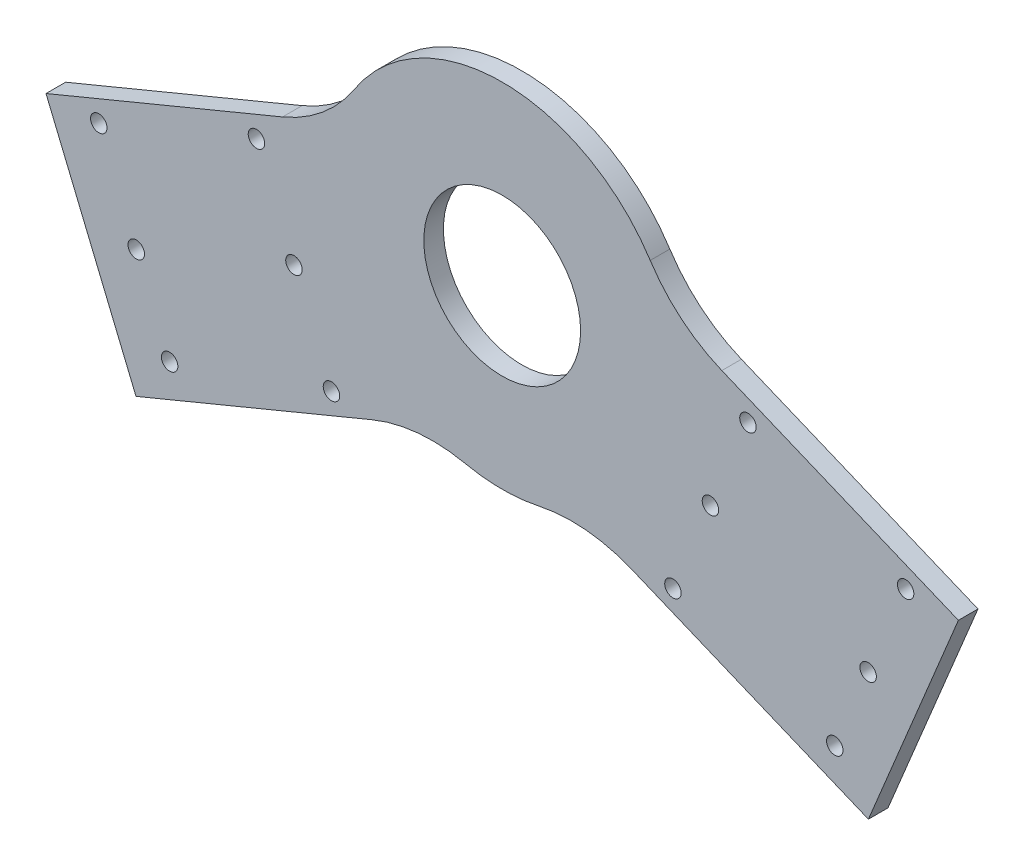
ISO-10303-21;
HEADER;
FILE_DESCRIPTION(('STEP AP214'),'2;1');
FILE_NAME('part.step','',(''),(''),'','','');
FILE_SCHEMA(('AUTOMOTIVE_DESIGN { 1 0 10303 214 1 1 1 1 }'));
ENDSEC;
DATA;
#1=APPLICATION_CONTEXT('core data for automotive mechanical design processes');
#2=APPLICATION_PROTOCOL_DEFINITION('international standard','automotive_design',2000,#1);
#3=PRODUCT_CONTEXT('',#1,'mechanical');
#4=PRODUCT('Part','Part','',(#3));
#5=PRODUCT_RELATED_PRODUCT_CATEGORY('part','',(#4));
#6=PRODUCT_DEFINITION_FORMATION('','',#4);
#7=PRODUCT_DEFINITION_CONTEXT('part definition',#1,'design');
#8=PRODUCT_DEFINITION('design','',#6,#7);
#9=PRODUCT_DEFINITION_SHAPE('','',#8);
#10=(LENGTH_UNIT() NAMED_UNIT(*) SI_UNIT(.MILLI.,.METRE.));
#11=(NAMED_UNIT(*) PLANE_ANGLE_UNIT() SI_UNIT($,.RADIAN.));
#12=(NAMED_UNIT(*) SI_UNIT($,.STERADIAN.) SOLID_ANGLE_UNIT());
#13=UNCERTAINTY_MEASURE_WITH_UNIT(LENGTH_MEASURE(1.E-05),#10,'distance_accuracy_value','');
#14=(GEOMETRIC_REPRESENTATION_CONTEXT(3) GLOBAL_UNCERTAINTY_ASSIGNED_CONTEXT((#13)) GLOBAL_UNIT_ASSIGNED_CONTEXT((#10,
#11,#12)) REPRESENTATION_CONTEXT('',''));
#15=CARTESIAN_POINT('',(0.,0.,0.));
#16=DIRECTION('',(0.,0.,1.));
#17=DIRECTION('',(1.,0.,0.));
#18=AXIS2_PLACEMENT_3D('',#15,#16,#17);
#19=CARTESIAN_POINT('',(0.,0.,5.));
#20=DIRECTION('',(0.,0.,-1.));
#21=DIRECTION('',(-1.,0.,0.));
#22=AXIS2_PLACEMENT_3D('',#19,#20,#21);
#23=CYLINDRICAL_SURFACE('',#22,45.);
#24=CARTESIAN_POINT('',(0.,0.,0.));
#25=DIRECTION('',(0.,0.,1.));
#26=DIRECTION('',(1.,0.,0.));
#27=AXIS2_PLACEMENT_3D('',#24,#25,#26);
#28=CIRCLE('',#27,45.);
#29=CARTESIAN_POINT('',(9.40236221556252,-44.006767488278,0.));
#30=VERTEX_POINT('',#29);
#31=CARTESIAN_POINT('',(-9.40236221556252,-44.006767488278,0.));
#32=VERTEX_POINT('',#31);
#33=EDGE_CURVE('E244',#30,#32,#28,.F.);
#34=ORIENTED_EDGE('',*,*,#33,.F.);
#35=DIRECTION('',(0.,0.,-1.));
#36=VECTOR('',#35,1.);
#37=CARTESIAN_POINT('',(9.40236221556252,-44.006767488278,5.));
#38=LINE('',#37,#36);
#39=CARTESIAN_POINT('',(9.40236221556252,-44.006767488278,5.));
#40=VERTEX_POINT('',#39);
#41=EDGE_CURVE('E315',#30,#40,#38,.F.);
#42=ORIENTED_EDGE('',*,*,#41,.T.);
#43=CARTESIAN_POINT('',(0.,0.,5.));
#44=DIRECTION('',(0.,0.,1.));
#45=DIRECTION('',(1.,0.,0.));
#46=AXIS2_PLACEMENT_3D('',#43,#44,#45);
#47=CIRCLE('',#46,45.);
#48=CARTESIAN_POINT('',(-9.40236221556252,-44.006767488278,5.));
#49=VERTEX_POINT('',#48);
#50=EDGE_CURVE('E167',#40,#49,#47,.F.);
#51=ORIENTED_EDGE('',*,*,#50,.T.);
#52=DIRECTION('',(0.,0.,-1.));
#53=VECTOR('',#52,1.);
#54=CARTESIAN_POINT('',(-9.40236221556252,-44.006767488278,5.));
#55=LINE('',#54,#53);
#56=EDGE_CURVE('E311',#49,#32,#55,.T.);
#57=ORIENTED_EDGE('',*,*,#56,.T.);
#58=EDGE_LOOP('',(#34,#42,#51,#57));
#59=FACE_BOUND('',#58,.T.);
#60=ADVANCED_FACE('F46',(#59),#23,.T.);
#61=CARTESIAN_POINT('',(-11.4805029709528,-27.7163859753385,5.));
#62=DIRECTION('',(-0.382683432365094,-0.923879532511285,0.));
#63=DIRECTION('',(0.923879532511285,-0.382683432365094,0.));
#64=AXIS2_PLACEMENT_3D('',#61,#62,#63);
#65=PLANE('',#64);
#66=DIRECTION('',(-0.923879532511285,0.382683432365094,0.));
#67=VECTOR('',#66,1.);
#68=CARTESIAN_POINT('',(-11.4805029709528,-27.7163859753385,5.));
#69=LINE('',#68,#67);
#70=CARTESIAN_POINT('',(93.4177211956894,-71.1666530940154,5.));
#71=VERTEX_POINT('',#70);
#72=CARTESIAN_POINT('',(33.0673548128885,-46.1687128440737,5.));
#73=VERTEX_POINT('',#72);
#74=EDGE_CURVE('E141',#71,#73,#69,.T.);
#75=ORIENTED_EDGE('',*,*,#74,.T.);
#76=DIRECTION('',(0.,0.,1.));
#77=VECTOR('',#76,1.);
#78=CARTESIAN_POINT('',(33.0673548128885,-46.1687128440737,0.));
#79=LINE('',#78,#77);
#80=CARTESIAN_POINT('',(33.0673548128885,-46.1687128440737,0.));
#81=VERTEX_POINT('',#80);
#82=EDGE_CURVE('E149',#73,#81,#79,.F.);
#83=ORIENTED_EDGE('',*,*,#82,.T.);
#84=DIRECTION('',(-0.923879532511285,0.382683432365094,0.));
#85=VECTOR('',#84,1.);
#86=CARTESIAN_POINT('',(-11.4805029709528,-27.7163859753385,0.));
#87=LINE('',#86,#85);
#88=CARTESIAN_POINT('',(93.4177211956894,-71.1666530940154,0.));
#89=VERTEX_POINT('',#88);
#90=EDGE_CURVE('E144',#89,#81,#87,.T.);
#91=ORIENTED_EDGE('',*,*,#90,.F.);
#92=DIRECTION('',(0.,0.,-1.));
#93=VECTOR('',#92,1.);
#94=CARTESIAN_POINT('',(93.4177211956894,-71.1666530940154,5.));
#95=LINE('',#94,#93);
#96=EDGE_CURVE('E136',#71,#89,#95,.T.);
#97=ORIENTED_EDGE('',*,*,#96,.F.);
#98=EDGE_LOOP('',(#75,#83,#91,#97));
#99=FACE_BOUND('',#98,.T.);
#100=ADVANCED_FACE('F138',(#99),#65,.T.);
#101=CARTESIAN_POINT('',(104.898224166642,-43.4502671186769,5.));
#102=DIRECTION('',(-0.923879532511285,0.382683432365094,0.));
#103=DIRECTION('',(-0.382683432365094,-0.923879532511285,0.));
#104=AXIS2_PLACEMENT_3D('',#101,#102,#103);
#105=PLANE('',#104);
#106=DIRECTION('',(0.382683432365094,0.923879532511285,0.));
#107=VECTOR('',#106,1.);
#108=CARTESIAN_POINT('',(104.898224166642,-43.4502671186769,0.));
#109=LINE('',#108,#107);
#110=CARTESIAN_POINT('',(116.378727137595,-15.7338811433383,0.));
#111=VERTEX_POINT('',#110);
#112=EDGE_CURVE('E250',#89,#111,#109,.T.);
#113=ORIENTED_EDGE('',*,*,#112,.T.);
#114=DIRECTION('',(0.,0.,-1.));
#115=VECTOR('',#114,1.);
#116=CARTESIAN_POINT('',(116.378727137595,-15.7338811433383,5.));
#117=LINE('',#116,#115);
#118=CARTESIAN_POINT('',(116.378727137595,-15.7338811433383,5.));
#119=VERTEX_POINT('',#118);
#120=EDGE_CURVE('E150',#119,#111,#117,.T.);
#121=ORIENTED_EDGE('',*,*,#120,.F.);
#122=DIRECTION('',(0.382683432365094,0.923879532511285,0.));
#123=VECTOR('',#122,1.);
#124=CARTESIAN_POINT('',(104.898224166642,-43.4502671186769,5.));
#125=LINE('',#124,#123);
#126=EDGE_CURVE('E154',#71,#119,#125,.T.);
#127=ORIENTED_EDGE('',*,*,#126,.F.);
#128=ORIENTED_EDGE('',*,*,#96,.T.);
#129=EDGE_LOOP('',(#113,#121,#127,#128));
#130=FACE_BOUND('',#129,.T.);
#131=ADVANCED_FACE('F155',(#130),#105,.F.);
#132=CARTESIAN_POINT('',(11.4805029709528,27.7163859753386,5.));
#133=DIRECTION('',(-0.382683432365094,-0.923879532511285,0.));
#134=DIRECTION('',(0.923879532511285,-0.382683432365094,0.));
#135=AXIS2_PLACEMENT_3D('',#132,#133,#134);
#136=PLANE('',#135);
#137=DIRECTION('',(-0.923879532511285,0.382683432365094,0.));
#138=VECTOR('',#137,1.);
#139=CARTESIAN_POINT('',(11.4805029709528,27.7163859753386,0.));
#140=LINE('',#139,#138);
#141=CARTESIAN_POINT('',(56.0283607547941,9.26405910660341,0.));
#142=VERTEX_POINT('',#141);
#143=EDGE_CURVE('E253',#111,#142,#140,.T.);
#144=ORIENTED_EDGE('',*,*,#143,.T.);
#145=DIRECTION('',(0.,0.,1.));
#146=VECTOR('',#145,1.);
#147=CARTESIAN_POINT('',(56.0283607547941,9.26405910660341,5.));
#148=LINE('',#147,#146);
#149=CARTESIAN_POINT('',(56.0283607547941,9.26405910660341,5.));
#150=VERTEX_POINT('',#149);
#151=EDGE_CURVE('E328',#142,#150,#148,.T.);
#152=ORIENTED_EDGE('',*,*,#151,.T.);
#153=DIRECTION('',(-0.923879532511285,0.382683432365094,0.));
#154=VECTOR('',#153,1.);
#155=CARTESIAN_POINT('',(11.4805029709528,27.7163859753386,5.));
#156=LINE('',#155,#154);
#157=EDGE_CURVE('E159',#119,#150,#156,.T.);
#158=ORIENTED_EDGE('',*,*,#157,.F.);
#159=ORIENTED_EDGE('',*,*,#120,.T.);
#160=EDGE_LOOP('',(#144,#152,#158,#159));
#161=FACE_BOUND('',#160,.T.);
#162=ADVANCED_FACE('F507',(#161),#136,.F.);
#163=CARTESIAN_POINT('',(0.,0.,5.));
#164=DIRECTION('',(0.,0.,-1.));
#165=DIRECTION('',(-1.,0.,0.));
#166=AXIS2_PLACEMENT_3D('',#163,#164,#165);
#167=CYLINDRICAL_SURFACE('',#166,45.);
#168=CARTESIAN_POINT('',(0.,0.,5.));
#169=DIRECTION('',(0.,0.,1.));
#170=DIRECTION('',(1.,0.,0.));
#171=AXIS2_PLACEMENT_3D('',#168,#169,#170);
#172=CIRCLE('',#171,45.);
#173=CARTESIAN_POINT('',(37.7659577908577,24.4690096272643,5.));
#174=VERTEX_POINT('',#173);
#175=CARTESIAN_POINT('',(-37.7659577908577,24.4690096272643,5.));
#176=VERTEX_POINT('',#175);
#177=EDGE_CURVE('E177',#174,#176,#172,.T.);
#178=ORIENTED_EDGE('',*,*,#177,.F.);
#179=DIRECTION('',(0.,0.,-1.));
#180=VECTOR('',#179,1.);
#181=CARTESIAN_POINT('',(37.7659577908577,24.4690096272643,5.));
#182=LINE('',#181,#180);
#183=CARTESIAN_POINT('',(37.7659577908577,24.4690096272643,0.));
#184=VERTEX_POINT('',#183);
#185=EDGE_CURVE('E324',#174,#184,#182,.T.);
#186=ORIENTED_EDGE('',*,*,#185,.T.);
#187=CARTESIAN_POINT('',(0.,0.,0.));
#188=DIRECTION('',(0.,0.,1.));
#189=DIRECTION('',(1.,0.,0.));
#190=AXIS2_PLACEMENT_3D('',#187,#188,#189);
#191=CIRCLE('',#190,45.);
#192=CARTESIAN_POINT('',(-37.7659577908577,24.4690096272643,0.));
#193=VERTEX_POINT('',#192);
#194=EDGE_CURVE('E257',#184,#193,#191,.T.);
#195=ORIENTED_EDGE('',*,*,#194,.T.);
#196=DIRECTION('',(0.,0.,-1.));
#197=VECTOR('',#196,1.);
#198=CARTESIAN_POINT('',(-37.7659577908577,24.4690096272643,5.));
#199=LINE('',#198,#197);
#200=EDGE_CURVE('E321',#193,#176,#199,.F.);
#201=ORIENTED_EDGE('',*,*,#200,.T.);
#202=EDGE_LOOP('',(#178,#186,#195,#201));
#203=FACE_BOUND('',#202,.T.);
#204=ADVANCED_FACE('F358',(#203),#167,.T.);
#205=CARTESIAN_POINT('',(-11.4805029709528,27.7163859753386,5.));
#206=DIRECTION('',(-0.382683432365094,0.923879532511285,0.));
#207=DIRECTION('',(-0.923879532511285,-0.382683432365094,0.));
#208=AXIS2_PLACEMENT_3D('',#205,#206,#207);
#209=PLANE('',#208);
#210=DIRECTION('',(0.923879532511285,0.382683432365094,0.));
#211=VECTOR('',#210,1.);
#212=CARTESIAN_POINT('',(-11.4805029709528,27.7163859753386,5.));
#213=LINE('',#212,#211);
#214=CARTESIAN_POINT('',(-116.378727137595,-15.7338811433383,5.));
#215=VERTEX_POINT('',#214);
#216=CARTESIAN_POINT('',(-56.0283607547941,9.26405910660341,5.));
#217=VERTEX_POINT('',#216);
#218=EDGE_CURVE('E180',#215,#217,#213,.T.);
#219=ORIENTED_EDGE('',*,*,#218,.T.);
#220=DIRECTION('',(0.,0.,-1.));
#221=VECTOR('',#220,1.);
#222=CARTESIAN_POINT('',(-56.0283607547941,9.26405910660341,5.));
#223=LINE('',#222,#221);
#224=CARTESIAN_POINT('',(-56.0283607547941,9.26405910660341,0.));
#225=VERTEX_POINT('',#224);
#226=EDGE_CURVE('E331',#217,#225,#223,.T.);
#227=ORIENTED_EDGE('',*,*,#226,.T.);
#228=DIRECTION('',(0.923879532511285,0.382683432365094,0.));
#229=VECTOR('',#228,1.);
#230=CARTESIAN_POINT('',(-11.4805029709528,27.7163859753386,0.));
#231=LINE('',#230,#229);
#232=CARTESIAN_POINT('',(-116.378727137595,-15.7338811433383,0.));
#233=VERTEX_POINT('',#232);
#234=EDGE_CURVE('E261',#233,#225,#231,.T.);
#235=ORIENTED_EDGE('',*,*,#234,.F.);
#236=DIRECTION('',(0.,0.,-1.));
#237=VECTOR('',#236,1.);
#238=CARTESIAN_POINT('',(-116.378727137595,-15.7338811433383,5.));
#239=LINE('',#238,#237);
#240=EDGE_CURVE('E304',#215,#233,#239,.T.);
#241=ORIENTED_EDGE('',*,*,#240,.F.);
#242=EDGE_LOOP('',(#219,#227,#235,#241));
#243=FACE_BOUND('',#242,.T.);
#244=ADVANCED_FACE('F361',(#243),#209,.T.);
#245=CARTESIAN_POINT('',(-104.898224166642,-43.4502671186769,5.));
#246=DIRECTION('',(-0.923879532511285,-0.382683432365094,0.));
#247=DIRECTION('',(0.382683432365094,-0.923879532511285,0.));
#248=AXIS2_PLACEMENT_3D('',#245,#246,#247);
#249=PLANE('',#248);
#250=DIRECTION('',(-0.382683432365094,0.923879532511285,0.));
#251=VECTOR('',#250,1.);
#252=CARTESIAN_POINT('',(-104.898224166642,-43.4502671186769,0.));
#253=LINE('',#252,#251);
#254=CARTESIAN_POINT('',(-93.4177211956894,-71.1666530940154,0.));
#255=VERTEX_POINT('',#254);
#256=EDGE_CURVE('E265',#255,#233,#253,.T.);
#257=ORIENTED_EDGE('',*,*,#256,.F.);
#258=DIRECTION('',(0.,0.,-1.));
#259=VECTOR('',#258,1.);
#260=CARTESIAN_POINT('',(-93.4177211956894,-71.1666530940154,5.));
#261=LINE('',#260,#259);
#262=CARTESIAN_POINT('',(-93.4177211956894,-71.1666530940154,5.));
#263=VERTEX_POINT('',#262);
#264=EDGE_CURVE('E219',#263,#255,#261,.T.);
#265=ORIENTED_EDGE('',*,*,#264,.F.);
#266=DIRECTION('',(-0.382683432365094,0.923879532511285,0.));
#267=VECTOR('',#266,1.);
#268=CARTESIAN_POINT('',(-104.898224166642,-43.4502671186769,5.));
#269=LINE('',#268,#267);
#270=EDGE_CURVE('E183',#263,#215,#269,.T.);
#271=ORIENTED_EDGE('',*,*,#270,.T.);
#272=ORIENTED_EDGE('',*,*,#240,.T.);
#273=EDGE_LOOP('',(#257,#265,#271,#272));
#274=FACE_BOUND('',#273,.T.);
#275=ADVANCED_FACE('F365',(#274),#249,.T.);
#276=CARTESIAN_POINT('',(43.5569293555824,-45.1016758817191,5.));
#277=DIRECTION('',(0.,0.,-1.));
#278=DIRECTION('',(-1.,0.,0.));
#279=AXIS2_PLACEMENT_3D('',#276,#277,#278);
#280=CYLINDRICAL_SURFACE('',#279,2.1);
#281=CARTESIAN_POINT('',(43.5569293555824,-45.1016758817191,5.));
#282=DIRECTION('',(0.,0.,1.));
#283=DIRECTION('',(1.,0.,0.));
#284=AXIS2_PLACEMENT_3D('',#281,#282,#283);
#285=CIRCLE('',#284,2.1);
#286=CARTESIAN_POINT('',(45.6569293555824,-45.1016758817191,5.));
#287=VERTEX_POINT('',#286);
#288=EDGE_CURVE('E211',#287,#287,#285,.F.);
#289=ORIENTED_EDGE('',*,*,#288,.F.);
#290=EDGE_LOOP('',(#289));
#291=FACE_BOUND('',#290,.T.);
#292=CARTESIAN_POINT('',(43.5569293555824,-45.1016758817191,0.));
#293=DIRECTION('',(0.,0.,1.));
#294=DIRECTION('',(1.,0.,0.));
#295=AXIS2_PLACEMENT_3D('',#292,#293,#294);
#296=CIRCLE('',#295,2.1);
#297=CARTESIAN_POINT('',(45.6569293555824,-45.1016758817191,0.));
#298=VERTEX_POINT('',#297);
#299=EDGE_CURVE('E293',#298,#298,#296,.F.);
#300=ORIENTED_EDGE('',*,*,#299,.T.);
#301=EDGE_LOOP('',(#300));
#302=FACE_BOUND('',#301,.T.);
#303=ADVANCED_FACE('F476',(#291,#302),#280,.F.);
#304=CARTESIAN_POINT('',(-43.5569293555824,-45.1016758817191,5.));
#305=DIRECTION('',(0.,0.,-1.));
#306=DIRECTION('',(-1.,0.,0.));
#307=AXIS2_PLACEMENT_3D('',#304,#305,#306);
#308=CYLINDRICAL_SURFACE('',#307,2.1);
#309=CARTESIAN_POINT('',(-43.5569293555824,-45.1016758817191,5.));
#310=DIRECTION('',(0.,0.,1.));
#311=DIRECTION('',(1.,0.,0.));
#312=AXIS2_PLACEMENT_3D('',#309,#310,#311);
#313=CIRCLE('',#312,2.1);
#314=CARTESIAN_POINT('',(-41.4569293555824,-45.1016758817191,5.));
#315=VERTEX_POINT('',#314);
#316=EDGE_CURVE('E207',#315,#315,#313,.T.);
#317=ORIENTED_EDGE('',*,*,#316,.T.);
#318=EDGE_LOOP('',(#317));
#319=FACE_BOUND('',#318,.T.);
#320=CARTESIAN_POINT('',(-43.5569293555824,-45.1016758817191,0.));
#321=DIRECTION('',(0.,0.,1.));
#322=DIRECTION('',(1.,0.,0.));
#323=AXIS2_PLACEMENT_3D('',#320,#321,#322);
#324=CIRCLE('',#323,2.1);
#325=CARTESIAN_POINT('',(-41.4569293555824,-45.1016758817191,0.));
#326=VERTEX_POINT('',#325);
#327=EDGE_CURVE('E289',#326,#326,#324,.T.);
#328=ORIENTED_EDGE('',*,*,#327,.F.);
#329=EDGE_LOOP('',(#328));
#330=FACE_BOUND('',#329,.T.);
#331=ADVANCED_FACE('F479',(#319,#330),#308,.F.);
#332=CARTESIAN_POINT('',(-53.1240151647098,-22.004687568937,5.));
#333=DIRECTION('',(0.,0.,-1.));
#334=DIRECTION('',(-1.,0.,0.));
#335=AXIS2_PLACEMENT_3D('',#332,#333,#334);
#336=CYLINDRICAL_SURFACE('',#335,2.1);
#337=CARTESIAN_POINT('',(-53.1240151647098,-22.004687568937,5.));
#338=DIRECTION('',(0.,0.,1.));
#339=DIRECTION('',(1.,0.,0.));
#340=AXIS2_PLACEMENT_3D('',#337,#338,#339);
#341=CIRCLE('',#340,2.1);
#342=CARTESIAN_POINT('',(-51.0240151647098,-22.004687568937,5.));
#343=VERTEX_POINT('',#342);
#344=EDGE_CURVE('E203',#343,#343,#341,.T.);
#345=ORIENTED_EDGE('',*,*,#344,.T.);
#346=EDGE_LOOP('',(#345));
#347=FACE_BOUND('',#346,.T.);
#348=CARTESIAN_POINT('',(-53.1240151647098,-22.004687568937,0.));
#349=DIRECTION('',(0.,0.,1.));
#350=DIRECTION('',(1.,0.,0.));
#351=AXIS2_PLACEMENT_3D('',#348,#349,#350);
#352=CIRCLE('',#351,2.1);
#353=CARTESIAN_POINT('',(-51.0240151647098,-22.004687568937,0.));
#354=VERTEX_POINT('',#353);
#355=EDGE_CURVE('E285',#354,#354,#352,.T.);
#356=ORIENTED_EDGE('',*,*,#355,.F.);
#357=EDGE_LOOP('',(#356));
#358=FACE_BOUND('',#357,.T.);
#359=ADVANCED_FACE('F483',(#347,#358),#336,.F.);
#360=CARTESIAN_POINT('',(-62.6911009738371,1.0923007438451,5.));
#361=DIRECTION('',(0.,0.,-1.));
#362=DIRECTION('',(-1.,0.,0.));
#363=AXIS2_PLACEMENT_3D('',#360,#361,#362);
#364=CYLINDRICAL_SURFACE('',#363,2.1);
#365=CARTESIAN_POINT('',(-62.6911009738371,1.0923007438451,5.));
#366=DIRECTION('',(0.,0.,1.));
#367=DIRECTION('',(1.,0.,0.));
#368=AXIS2_PLACEMENT_3D('',#365,#366,#367);
#369=CIRCLE('',#368,2.1);
#370=CARTESIAN_POINT('',(-60.5911009738371,1.0923007438451,5.));
#371=VERTEX_POINT('',#370);
#372=EDGE_CURVE('E199',#371,#371,#369,.T.);
#373=ORIENTED_EDGE('',*,*,#372,.T.);
#374=EDGE_LOOP('',(#373));
#375=FACE_BOUND('',#374,.T.);
#376=CARTESIAN_POINT('',(-62.6911009738371,1.0923007438451,0.));
#377=DIRECTION('',(0.,0.,1.));
#378=DIRECTION('',(1.,0.,0.));
#379=AXIS2_PLACEMENT_3D('',#376,#377,#378);
#380=CIRCLE('',#379,2.1);
#381=CARTESIAN_POINT('',(-60.5911009738371,1.0923007438451,0.));
#382=VERTEX_POINT('',#381);
#383=EDGE_CURVE('E281',#382,#382,#380,.T.);
#384=ORIENTED_EDGE('',*,*,#383,.F.);
#385=EDGE_LOOP('',(#384));
#386=FACE_BOUND('',#385,.T.);
#387=ADVANCED_FACE('F487',(#375,#386),#364,.F.);
#388=CARTESIAN_POINT('',(93.3497300102512,-38.6667242141132,5.));
#389=DIRECTION('',(0.,0.,-1.));
#390=DIRECTION('',(-1.,0.,0.));
#391=AXIS2_PLACEMENT_3D('',#388,#389,#390);
#392=CYLINDRICAL_SURFACE('',#391,2.1);
#393=CARTESIAN_POINT('',(93.3497300102512,-38.6667242141132,5.));
#394=DIRECTION('',(0.,0.,1.));
#395=DIRECTION('',(1.,0.,0.));
#396=AXIS2_PLACEMENT_3D('',#393,#394,#395);
#397=CIRCLE('',#396,2.1);
#398=CARTESIAN_POINT('',(95.4497300102512,-38.6667242141132,5.));
#399=VERTEX_POINT('',#398);
#400=EDGE_CURVE('E195',#399,#399,#397,.F.);
#401=ORIENTED_EDGE('',*,*,#400,.F.);
#402=EDGE_LOOP('',(#401));
#403=FACE_BOUND('',#402,.T.);
#404=CARTESIAN_POINT('',(93.3497300102512,-38.6667242141132,0.));
#405=DIRECTION('',(0.,0.,1.));
#406=DIRECTION('',(1.,0.,0.));
#407=AXIS2_PLACEMENT_3D('',#404,#405,#406);
#408=CIRCLE('',#407,2.1);
#409=CARTESIAN_POINT('',(95.4497300102512,-38.6667242141132,0.));
#410=VERTEX_POINT('',#409);
#411=EDGE_CURVE('E277',#410,#410,#408,.F.);
#412=ORIENTED_EDGE('',*,*,#411,.T.);
#413=EDGE_LOOP('',(#412));
#414=FACE_BOUND('',#413,.T.);
#415=ADVANCED_FACE('F491',(#403,#414),#392,.F.);
#416=CARTESIAN_POINT('',(0.,0.,5.));
#417=DIRECTION('',(0.,0.,-1.));
#418=DIRECTION('',(-1.,0.,0.));
#419=AXIS2_PLACEMENT_3D('',#416,#417,#418);
#420=CYLINDRICAL_SURFACE('',#419,20.);
#421=CARTESIAN_POINT('',(0.,0.,5.));
#422=DIRECTION('',(0.,0.,1.));
#423=DIRECTION('',(1.,0.,0.));
#424=AXIS2_PLACEMENT_3D('',#421,#422,#423);
#425=CIRCLE('',#424,20.);
#426=CARTESIAN_POINT('',(20.,0.,5.));
#427=VERTEX_POINT('',#426);
#428=EDGE_CURVE('E191',#427,#427,#425,.T.);
#429=ORIENTED_EDGE('',*,*,#428,.T.);
#430=EDGE_LOOP('',(#429));
#431=FACE_BOUND('',#430,.T.);
#432=CARTESIAN_POINT('',(0.,0.,0.));
#433=DIRECTION('',(0.,0.,1.));
#434=DIRECTION('',(1.,0.,0.));
#435=AXIS2_PLACEMENT_3D('',#432,#433,#434);
#436=CIRCLE('',#435,20.);
#437=CARTESIAN_POINT('',(20.,0.,0.));
#438=VERTEX_POINT('',#437);
#439=EDGE_CURVE('E273',#438,#438,#436,.T.);
#440=ORIENTED_EDGE('',*,*,#439,.F.);
#441=EDGE_LOOP('',(#440));
#442=FACE_BOUND('',#441,.T.);
#443=ADVANCED_FACE('F495',(#431,#442),#420,.F.);
#444=CARTESIAN_POINT('',(11.4805029709528,-27.7163859753385,5.));
#445=DIRECTION('',(-0.382683432365094,0.923879532511285,0.));
#446=DIRECTION('',(-0.923879532511285,-0.382683432365094,0.));
#447=AXIS2_PLACEMENT_3D('',#444,#445,#446);
#448=PLANE('',#447);
#449=DIRECTION('',(0.923879532511285,0.382683432365094,0.));
#450=VECTOR('',#449,1.);
#451=CARTESIAN_POINT('',(11.4805029709528,-27.7163859753385,0.));
#452=LINE('',#451,#450);
#453=CARTESIAN_POINT('',(-33.0673548128885,-46.1687128440737,0.));
#454=VERTEX_POINT('',#453);
#455=EDGE_CURVE('E269',#255,#454,#452,.T.);
#456=ORIENTED_EDGE('',*,*,#455,.T.);
#457=DIRECTION('',(0.,0.,-1.));
#458=VECTOR('',#457,1.);
#459=CARTESIAN_POINT('',(-33.0673548128885,-46.1687128440737,5.));
#460=LINE('',#459,#458);
#461=CARTESIAN_POINT('',(-33.0673548128885,-46.1687128440737,5.));
#462=VERTEX_POINT('',#461);
#463=EDGE_CURVE('E318',#454,#462,#460,.F.);
#464=ORIENTED_EDGE('',*,*,#463,.T.);
#465=DIRECTION('',(0.923879532511285,0.382683432365094,0.));
#466=VECTOR('',#465,1.);
#467=CARTESIAN_POINT('',(11.4805029709528,-27.7163859753385,5.));
#468=LINE('',#467,#466);
#469=EDGE_CURVE('E187',#263,#462,#468,.T.);
#470=ORIENTED_EDGE('',*,*,#469,.F.);
#471=ORIENTED_EDGE('',*,*,#264,.T.);
#472=EDGE_LOOP('',(#456,#464,#470,#471));
#473=FACE_BOUND('',#472,.T.);
#474=ADVANCED_FACE('F369',(#473),#448,.F.);
#475=CARTESIAN_POINT('',(-93.3497300102512,-38.6667242141132,5.));
#476=DIRECTION('',(0.,0.,-1.));
#477=DIRECTION('',(-1.,0.,0.));
#478=AXIS2_PLACEMENT_3D('',#475,#476,#477);
#479=CYLINDRICAL_SURFACE('',#478,2.1);
#480=CARTESIAN_POINT('',(-93.3497300102512,-38.6667242141132,5.));
#481=DIRECTION('',(0.,0.,1.));
#482=DIRECTION('',(1.,0.,0.));
#483=AXIS2_PLACEMENT_3D('',#480,#481,#482);
#484=CIRCLE('',#483,2.1);
#485=CARTESIAN_POINT('',(-91.2497300102511,-38.6667242141132,5.));
#486=VERTEX_POINT('',#485);
#487=EDGE_CURVE('E171',#486,#486,#484,.T.);
#488=ORIENTED_EDGE('',*,*,#487,.T.);
#489=EDGE_LOOP('',(#488));
#490=FACE_BOUND('',#489,.T.);
#491=CARTESIAN_POINT('',(-93.3497300102512,-38.6667242141132,0.));
#492=DIRECTION('',(0.,0.,1.));
#493=DIRECTION('',(1.,0.,0.));
#494=AXIS2_PLACEMENT_3D('',#491,#492,#493);
#495=CIRCLE('',#494,2.1);
#496=CARTESIAN_POINT('',(-91.2497300102511,-38.6667242141132,0.));
#497=VERTEX_POINT('',#496);
#498=EDGE_CURVE('E240',#497,#497,#495,.T.);
#499=ORIENTED_EDGE('',*,*,#498,.F.);
#500=EDGE_LOOP('',(#499));
#501=FACE_BOUND('',#500,.T.);
#502=ADVANCED_FACE('F400',(#490,#501),#479,.F.);
#503=CARTESIAN_POINT('',(-102.916815819378,-15.5697359013311,5.));
#504=DIRECTION('',(0.,0.,-1.));
#505=DIRECTION('',(-1.,0.,0.));
#506=AXIS2_PLACEMENT_3D('',#503,#504,#505);
#507=CYLINDRICAL_SURFACE('',#506,2.1);
#508=CARTESIAN_POINT('',(-102.916815819378,-15.5697359013311,5.));
#509=DIRECTION('',(0.,0.,1.));
#510=DIRECTION('',(1.,0.,0.));
#511=AXIS2_PLACEMENT_3D('',#508,#509,#510);
#512=CIRCLE('',#511,2.1);
#513=CARTESIAN_POINT('',(-100.816815819378,-15.5697359013311,5.));
#514=VERTEX_POINT('',#513);
#515=EDGE_CURVE('E462',#514,#514,#512,.T.);
#516=ORIENTED_EDGE('',*,*,#515,.T.);
#517=EDGE_LOOP('',(#516));
#518=FACE_BOUND('',#517,.T.);
#519=CARTESIAN_POINT('',(-102.916815819378,-15.5697359013311,0.));
#520=DIRECTION('',(0.,0.,1.));
#521=DIRECTION('',(1.,0.,0.));
#522=AXIS2_PLACEMENT_3D('',#519,#520,#521);
#523=CIRCLE('',#522,2.1);
#524=CARTESIAN_POINT('',(-100.816815819378,-15.5697359013311,0.));
#525=VERTEX_POINT('',#524);
#526=EDGE_CURVE('E236',#525,#525,#523,.T.);
#527=ORIENTED_EDGE('',*,*,#526,.F.);
#528=EDGE_LOOP('',(#527));
#529=FACE_BOUND('',#528,.T.);
#530=ADVANCED_FACE('F403',(#518,#529),#507,.F.);
#531=CARTESIAN_POINT('',(-84.838757104316,-59.2140304326114,5.));
#532=DIRECTION('',(0.,0.,-1.));
#533=DIRECTION('',(-1.,0.,0.));
#534=AXIS2_PLACEMENT_3D('',#531,#532,#533);
#535=CYLINDRICAL_SURFACE('',#534,2.1);
#536=CARTESIAN_POINT('',(-84.838757104316,-59.2140304326114,5.));
#537=DIRECTION('',(0.,0.,1.));
#538=DIRECTION('',(1.,0.,0.));
#539=AXIS2_PLACEMENT_3D('',#536,#537,#538);
#540=CIRCLE('',#539,2.1);
#541=CARTESIAN_POINT('',(-82.738757104316,-59.2140304326114,5.));
#542=VERTEX_POINT('',#541);
#543=EDGE_CURVE('E458',#542,#542,#540,.T.);
#544=ORIENTED_EDGE('',*,*,#543,.T.);
#545=EDGE_LOOP('',(#544));
#546=FACE_BOUND('',#545,.T.);
#547=CARTESIAN_POINT('',(-84.838757104316,-59.2140304326114,0.));
#548=DIRECTION('',(0.,0.,1.));
#549=DIRECTION('',(1.,0.,0.));
#550=AXIS2_PLACEMENT_3D('',#547,#548,#549);
#551=CIRCLE('',#550,2.1);
#552=CARTESIAN_POINT('',(-82.738757104316,-59.2140304326114,0.));
#553=VERTEX_POINT('',#552);
#554=EDGE_CURVE('E232',#553,#553,#551,.T.);
#555=ORIENTED_EDGE('',*,*,#554,.F.);
#556=EDGE_LOOP('',(#555));
#557=FACE_BOUND('',#556,.T.);
#558=ADVANCED_FACE('F407',(#546,#557),#535,.F.);
#559=CARTESIAN_POINT('',(84.838757104316,-59.2140304326114,5.));
#560=DIRECTION('',(0.,0.,-1.));
#561=DIRECTION('',(-1.,0.,0.));
#562=AXIS2_PLACEMENT_3D('',#559,#560,#561);
#563=CYLINDRICAL_SURFACE('',#562,2.1);
#564=CARTESIAN_POINT('',(84.838757104316,-59.2140304326114,5.));
#565=DIRECTION('',(0.,0.,1.));
#566=DIRECTION('',(1.,0.,0.));
#567=AXIS2_PLACEMENT_3D('',#564,#565,#566);
#568=CIRCLE('',#567,2.1);
#569=CARTESIAN_POINT('',(86.9387571043161,-59.2140304326114,5.));
#570=VERTEX_POINT('',#569);
#571=EDGE_CURVE('E452',#570,#570,#568,.F.);
#572=ORIENTED_EDGE('',*,*,#571,.F.);
#573=EDGE_LOOP('',(#572));
#574=FACE_BOUND('',#573,.T.);
#575=CARTESIAN_POINT('',(84.838757104316,-59.2140304326114,0.));
#576=DIRECTION('',(0.,0.,1.));
#577=DIRECTION('',(1.,0.,0.));
#578=AXIS2_PLACEMENT_3D('',#575,#576,#577);
#579=CIRCLE('',#578,2.1);
#580=CARTESIAN_POINT('',(86.9387571043161,-59.2140304326114,0.));
#581=VERTEX_POINT('',#580);
#582=EDGE_CURVE('E228',#581,#581,#579,.F.);
#583=ORIENTED_EDGE('',*,*,#582,.T.);
#584=EDGE_LOOP('',(#583));
#585=FACE_BOUND('',#584,.T.);
#586=ADVANCED_FACE('F411',(#574,#585),#563,.F.);
#587=CARTESIAN_POINT('',(102.916815819378,-15.5697359013311,5.));
#588=DIRECTION('',(0.,0.,-1.));
#589=DIRECTION('',(-1.,0.,0.));
#590=AXIS2_PLACEMENT_3D('',#587,#588,#589);
#591=CYLINDRICAL_SURFACE('',#590,2.1);
#592=CARTESIAN_POINT('',(102.916815819378,-15.5697359013311,5.));
#593=DIRECTION('',(0.,0.,1.));
#594=DIRECTION('',(1.,0.,0.));
#595=AXIS2_PLACEMENT_3D('',#592,#593,#594);
#596=CIRCLE('',#595,2.1);
#597=CARTESIAN_POINT('',(105.016815819378,-15.5697359013311,5.));
#598=VERTEX_POINT('',#597);
#599=EDGE_CURVE('E448',#598,#598,#596,.F.);
#600=ORIENTED_EDGE('',*,*,#599,.F.);
#601=EDGE_LOOP('',(#600));
#602=FACE_BOUND('',#601,.T.);
#603=CARTESIAN_POINT('',(102.916815819378,-15.5697359013311,0.));
#604=DIRECTION('',(0.,0.,1.));
#605=DIRECTION('',(1.,0.,0.));
#606=AXIS2_PLACEMENT_3D('',#603,#604,#605);
#607=CIRCLE('',#606,2.1);
#608=CARTESIAN_POINT('',(105.016815819378,-15.5697359013311,0.));
#609=VERTEX_POINT('',#608);
#610=EDGE_CURVE('E224',#609,#609,#607,.F.);
#611=ORIENTED_EDGE('',*,*,#610,.T.);
#612=EDGE_LOOP('',(#611));
#613=FACE_BOUND('',#612,.T.);
#614=ADVANCED_FACE('F415',(#602,#613),#591,.F.);
#615=CARTESIAN_POINT('',(53.1240151647098,-22.004687568937,5.));
#616=DIRECTION('',(0.,0.,-1.));
#617=DIRECTION('',(-1.,0.,0.));
#618=AXIS2_PLACEMENT_3D('',#615,#616,#617);
#619=CYLINDRICAL_SURFACE('',#618,2.1);
#620=CARTESIAN_POINT('',(53.1240151647098,-22.004687568937,5.));
#621=DIRECTION('',(0.,0.,1.));
#622=DIRECTION('',(1.,0.,0.));
#623=AXIS2_PLACEMENT_3D('',#620,#621,#622);
#624=CIRCLE('',#623,2.1);
#625=CARTESIAN_POINT('',(55.2240151647098,-22.004687568937,5.));
#626=VERTEX_POINT('',#625);
#627=EDGE_CURVE('E301',#626,#626,#624,.F.);
#628=ORIENTED_EDGE('',*,*,#627,.F.);
#629=EDGE_LOOP('',(#628));
#630=FACE_BOUND('',#629,.T.);
#631=CARTESIAN_POINT('',(53.1240151647098,-22.004687568937,0.));
#632=DIRECTION('',(0.,0.,1.));
#633=DIRECTION('',(1.,0.,0.));
#634=AXIS2_PLACEMENT_3D('',#631,#632,#633);
#635=CIRCLE('',#634,2.1);
#636=CARTESIAN_POINT('',(55.2240151647098,-22.004687568937,0.));
#637=VERTEX_POINT('',#636);
#638=EDGE_CURVE('E220',#637,#637,#635,.F.);
#639=ORIENTED_EDGE('',*,*,#638,.T.);
#640=EDGE_LOOP('',(#639));
#641=FACE_BOUND('',#640,.T.);
#642=ADVANCED_FACE('F418',(#630,#641),#619,.F.);
#643=CARTESIAN_POINT('',(62.6911009738371,1.0923007438451,5.));
#644=DIRECTION('',(0.,0.,-1.));
#645=DIRECTION('',(-1.,0.,0.));
#646=AXIS2_PLACEMENT_3D('',#643,#644,#645);
#647=CYLINDRICAL_SURFACE('',#646,2.1);
#648=CARTESIAN_POINT('',(62.6911009738371,1.0923007438451,5.));
#649=DIRECTION('',(0.,0.,1.));
#650=DIRECTION('',(1.,0.,0.));
#651=AXIS2_PLACEMENT_3D('',#648,#649,#650);
#652=CIRCLE('',#651,2.1);
#653=CARTESIAN_POINT('',(64.7911009738371,1.0923007438451,5.));
#654=VERTEX_POINT('',#653);
#655=EDGE_CURVE('E215',#654,#654,#652,.F.);
#656=ORIENTED_EDGE('',*,*,#655,.F.);
#657=EDGE_LOOP('',(#656));
#658=FACE_BOUND('',#657,.T.);
#659=CARTESIAN_POINT('',(62.6911009738371,1.0923007438451,0.));
#660=DIRECTION('',(0.,0.,1.));
#661=DIRECTION('',(1.,0.,0.));
#662=AXIS2_PLACEMENT_3D('',#659,#660,#661);
#663=CIRCLE('',#662,2.1);
#664=CARTESIAN_POINT('',(64.7911009738371,1.0923007438451,0.));
#665=VERTEX_POINT('',#664);
#666=EDGE_CURVE('E297',#665,#665,#663,.F.);
#667=ORIENTED_EDGE('',*,*,#666,.T.);
#668=EDGE_LOOP('',(#667));
#669=FACE_BOUND('',#668,.T.);
#670=ADVANCED_FACE('F421',(#658,#669),#647,.F.);
#671=CARTESIAN_POINT('',(0.,0.,5.));
#672=DIRECTION('',(0.,0.,1.));
#673=DIRECTION('',(1.,0.,0.));
#674=AXIS2_PLACEMENT_3D('',#671,#672,#673);
#675=PLANE('',#674);
#676=ORIENTED_EDGE('',*,*,#627,.T.);
#677=EDGE_LOOP('',(#676));
#678=FACE_BOUND('',#677,.T.);
#679=ORIENTED_EDGE('',*,*,#599,.T.);
#680=EDGE_LOOP('',(#679));
#681=FACE_BOUND('',#680,.T.);
#682=ORIENTED_EDGE('',*,*,#571,.T.);
#683=EDGE_LOOP('',(#682));
#684=FACE_BOUND('',#683,.T.);
#685=ORIENTED_EDGE('',*,*,#543,.F.);
#686=EDGE_LOOP('',(#685));
#687=FACE_BOUND('',#686,.T.);
#688=ORIENTED_EDGE('',*,*,#515,.F.);
#689=EDGE_LOOP('',(#688));
#690=FACE_BOUND('',#689,.T.);
#691=ORIENTED_EDGE('',*,*,#487,.F.);
#692=EDGE_LOOP('',(#691));
#693=FACE_BOUND('',#692,.T.);
#694=ORIENTED_EDGE('',*,*,#50,.F.);
#695=CARTESIAN_POINT('',(17.7600175182848,-83.1238941445251,5.));
#696=DIRECTION('',(0.,0.,1.));
#697=DIRECTION('',(1.,0.,0.));
#698=AXIS2_PLACEMENT_3D('',#695,#696,#697);
#699=CIRCLE('',#698,40.);
#700=EDGE_CURVE('E165',#40,#73,#699,.F.);
#701=ORIENTED_EDGE('',*,*,#700,.T.);
#702=ORIENTED_EDGE('',*,*,#74,.F.);
#703=ORIENTED_EDGE('',*,*,#126,.T.);
#704=ORIENTED_EDGE('',*,*,#157,.T.);
#705=CARTESIAN_POINT('',(71.3356980493979,46.2192404070548,5.));
#706=DIRECTION('',(0.,0.,1.));
#707=DIRECTION('',(1.,0.,0.));
#708=AXIS2_PLACEMENT_3D('',#705,#706,#707);
#709=CIRCLE('',#708,40.);
#710=EDGE_CURVE('E348',#150,#174,#709,.F.);
#711=ORIENTED_EDGE('',*,*,#710,.T.);
#712=ORIENTED_EDGE('',*,*,#177,.T.);
#713=CARTESIAN_POINT('',(-71.3356980493979,46.2192404070548,5.));
#714=DIRECTION('',(0.,0.,1.));
#715=DIRECTION('',(1.,0.,0.));
#716=AXIS2_PLACEMENT_3D('',#713,#714,#715);
#717=CIRCLE('',#716,40.);
#718=EDGE_CURVE('E11',#176,#217,#717,.F.);
#719=ORIENTED_EDGE('',*,*,#718,.T.);
#720=ORIENTED_EDGE('',*,*,#218,.F.);
#721=ORIENTED_EDGE('',*,*,#270,.F.);
#722=ORIENTED_EDGE('',*,*,#469,.T.);
#723=CARTESIAN_POINT('',(-17.7600175182848,-83.1238941445251,5.));
#724=DIRECTION('',(0.,0.,1.));
#725=DIRECTION('',(1.,0.,0.));
#726=AXIS2_PLACEMENT_3D('',#723,#724,#725);
#727=CIRCLE('',#726,40.);
#728=EDGE_CURVE('E342',#462,#49,#727,.F.);
#729=ORIENTED_EDGE('',*,*,#728,.T.);
#730=EDGE_LOOP('',(#694,#701,#702,#703,#704,#711,#712,#719,#720,#721,#722,#729));
#731=FACE_BOUND('',#730,.T.);
#732=ORIENTED_EDGE('',*,*,#428,.F.);
#733=EDGE_LOOP('',(#732));
#734=FACE_BOUND('',#733,.T.);
#735=ORIENTED_EDGE('',*,*,#400,.T.);
#736=EDGE_LOOP('',(#735));
#737=FACE_BOUND('',#736,.T.);
#738=ORIENTED_EDGE('',*,*,#372,.F.);
#739=EDGE_LOOP('',(#738));
#740=FACE_BOUND('',#739,.T.);
#741=ORIENTED_EDGE('',*,*,#344,.F.);
#742=EDGE_LOOP('',(#741));
#743=FACE_BOUND('',#742,.T.);
#744=ORIENTED_EDGE('',*,*,#316,.F.);
#745=EDGE_LOOP('',(#744));
#746=FACE_BOUND('',#745,.T.);
#747=ORIENTED_EDGE('',*,*,#288,.T.);
#748=EDGE_LOOP('',(#747));
#749=FACE_BOUND('',#748,.T.);
#750=ORIENTED_EDGE('',*,*,#655,.T.);
#751=EDGE_LOOP('',(#750));
#752=FACE_BOUND('',#751,.T.);
#753=ADVANCED_FACE('F162',(#678,#681,#684,#687,#690,#693,#731,#734,#737,#740,#743,#746,#749,
#752),#675,.T.);
#754=CARTESIAN_POINT('',(0.,0.,0.));
#755=DIRECTION('',(0.,0.,1.));
#756=DIRECTION('',(1.,0.,0.));
#757=AXIS2_PLACEMENT_3D('',#754,#755,#756);
#758=PLANE('',#757);
#759=ORIENTED_EDGE('',*,*,#638,.F.);
#760=EDGE_LOOP('',(#759));
#761=FACE_BOUND('',#760,.T.);
#762=ORIENTED_EDGE('',*,*,#610,.F.);
#763=EDGE_LOOP('',(#762));
#764=FACE_BOUND('',#763,.T.);
#765=ORIENTED_EDGE('',*,*,#582,.F.);
#766=EDGE_LOOP('',(#765));
#767=FACE_BOUND('',#766,.T.);
#768=ORIENTED_EDGE('',*,*,#554,.T.);
#769=EDGE_LOOP('',(#768));
#770=FACE_BOUND('',#769,.T.);
#771=ORIENTED_EDGE('',*,*,#526,.T.);
#772=EDGE_LOOP('',(#771));
#773=FACE_BOUND('',#772,.T.);
#774=ORIENTED_EDGE('',*,*,#498,.T.);
#775=EDGE_LOOP('',(#774));
#776=FACE_BOUND('',#775,.T.);
#777=ORIENTED_EDGE('',*,*,#90,.T.);
#778=CARTESIAN_POINT('',(17.7600175182848,-83.1238941445251,0.));
#779=DIRECTION('',(0.,0.,1.));
#780=DIRECTION('',(1.,0.,0.));
#781=AXIS2_PLACEMENT_3D('',#778,#779,#780);
#782=CIRCLE('',#781,40.);
#783=EDGE_CURVE('E334',#81,#30,#782,.T.);
#784=ORIENTED_EDGE('',*,*,#783,.T.);
#785=ORIENTED_EDGE('',*,*,#33,.T.);
#786=CARTESIAN_POINT('',(-17.7600175182848,-83.1238941445251,0.));
#787=DIRECTION('',(0.,0.,1.));
#788=DIRECTION('',(1.,0.,0.));
#789=AXIS2_PLACEMENT_3D('',#786,#787,#788);
#790=CIRCLE('',#789,40.);
#791=EDGE_CURVE('E339',#32,#454,#790,.T.);
#792=ORIENTED_EDGE('',*,*,#791,.T.);
#793=ORIENTED_EDGE('',*,*,#455,.F.);
#794=ORIENTED_EDGE('',*,*,#256,.T.);
#795=ORIENTED_EDGE('',*,*,#234,.T.);
#796=CARTESIAN_POINT('',(-71.3356980493979,46.2192404070548,0.));
#797=DIRECTION('',(0.,0.,1.));
#798=DIRECTION('',(1.,0.,0.));
#799=AXIS2_PLACEMENT_3D('',#796,#797,#798);
#800=CIRCLE('',#799,40.);
#801=EDGE_CURVE('E55',#225,#193,#800,.T.);
#802=ORIENTED_EDGE('',*,*,#801,.T.);
#803=ORIENTED_EDGE('',*,*,#194,.F.);
#804=CARTESIAN_POINT('',(71.3356980493979,46.2192404070548,0.));
#805=DIRECTION('',(0.,0.,1.));
#806=DIRECTION('',(1.,0.,0.));
#807=AXIS2_PLACEMENT_3D('',#804,#805,#806);
#808=CIRCLE('',#807,40.);
#809=EDGE_CURVE('E345',#184,#142,#808,.T.);
#810=ORIENTED_EDGE('',*,*,#809,.T.);
#811=ORIENTED_EDGE('',*,*,#143,.F.);
#812=ORIENTED_EDGE('',*,*,#112,.F.);
#813=EDGE_LOOP('',(#777,#784,#785,#792,#793,#794,#795,#802,#803,#810,#811,#812));
#814=FACE_BOUND('',#813,.T.);
#815=ORIENTED_EDGE('',*,*,#439,.T.);
#816=EDGE_LOOP('',(#815));
#817=FACE_BOUND('',#816,.T.);
#818=ORIENTED_EDGE('',*,*,#411,.F.);
#819=EDGE_LOOP('',(#818));
#820=FACE_BOUND('',#819,.T.);
#821=ORIENTED_EDGE('',*,*,#383,.T.);
#822=EDGE_LOOP('',(#821));
#823=FACE_BOUND('',#822,.T.);
#824=ORIENTED_EDGE('',*,*,#355,.T.);
#825=EDGE_LOOP('',(#824));
#826=FACE_BOUND('',#825,.T.);
#827=ORIENTED_EDGE('',*,*,#327,.T.);
#828=EDGE_LOOP('',(#827));
#829=FACE_BOUND('',#828,.T.);
#830=ORIENTED_EDGE('',*,*,#299,.F.);
#831=EDGE_LOOP('',(#830));
#832=FACE_BOUND('',#831,.T.);
#833=ORIENTED_EDGE('',*,*,#666,.F.);
#834=EDGE_LOOP('',(#833));
#835=FACE_BOUND('',#834,.T.);
#836=ADVANCED_FACE('F353',(#761,#764,#767,#770,#773,#776,#814,#817,#820,#823,#826,#829,#832,
#835),#758,.F.);
#837=CARTESIAN_POINT('',(17.7600175182848,-83.1238941445251,5.));
#838=DIRECTION('',(0.,0.,-1.));
#839=DIRECTION('',(-1.,0.,0.));
#840=AXIS2_PLACEMENT_3D('',#837,#838,#839);
#841=CYLINDRICAL_SURFACE('',#840,40.);
#842=ORIENTED_EDGE('',*,*,#700,.F.);
#843=ORIENTED_EDGE('',*,*,#41,.F.);
#844=ORIENTED_EDGE('',*,*,#783,.F.);
#845=ORIENTED_EDGE('',*,*,#82,.F.);
#846=EDGE_LOOP('',(#842,#843,#844,#845));
#847=FACE_BOUND('',#846,.T.);
#848=ADVANCED_FACE('F379',(#847),#841,.F.);
#849=CARTESIAN_POINT('',(-17.7600175182848,-83.1238941445251,5.));
#850=DIRECTION('',(0.,0.,-1.));
#851=DIRECTION('',(-1.,0.,0.));
#852=AXIS2_PLACEMENT_3D('',#849,#850,#851);
#853=CYLINDRICAL_SURFACE('',#852,40.);
#854=ORIENTED_EDGE('',*,*,#728,.F.);
#855=ORIENTED_EDGE('',*,*,#463,.F.);
#856=ORIENTED_EDGE('',*,*,#791,.F.);
#857=ORIENTED_EDGE('',*,*,#56,.F.);
#858=EDGE_LOOP('',(#854,#855,#856,#857));
#859=FACE_BOUND('',#858,.T.);
#860=ADVANCED_FACE('F374',(#859),#853,.F.);
#861=CARTESIAN_POINT('',(71.3356980493979,46.2192404070548,5.));
#862=DIRECTION('',(0.,0.,-1.));
#863=DIRECTION('',(-1.,0.,0.));
#864=AXIS2_PLACEMENT_3D('',#861,#862,#863);
#865=CYLINDRICAL_SURFACE('',#864,40.);
#866=ORIENTED_EDGE('',*,*,#710,.F.);
#867=ORIENTED_EDGE('',*,*,#151,.F.);
#868=ORIENTED_EDGE('',*,*,#809,.F.);
#869=ORIENTED_EDGE('',*,*,#185,.F.);
#870=EDGE_LOOP('',(#866,#867,#868,#869));
#871=FACE_BOUND('',#870,.T.);
#872=ADVANCED_FACE('F386',(#871),#865,.F.);
#873=CARTESIAN_POINT('',(-71.3356980493979,46.2192404070548,5.));
#874=DIRECTION('',(0.,0.,-1.));
#875=DIRECTION('',(-1.,0.,0.));
#876=AXIS2_PLACEMENT_3D('',#873,#874,#875);
#877=CYLINDRICAL_SURFACE('',#876,40.);
#878=ORIENTED_EDGE('',*,*,#718,.F.);
#879=ORIENTED_EDGE('',*,*,#200,.F.);
#880=ORIENTED_EDGE('',*,*,#801,.F.);
#881=ORIENTED_EDGE('',*,*,#226,.F.);
#882=EDGE_LOOP('',(#878,#879,#880,#881));
#883=FACE_BOUND('',#882,.T.);
#884=ADVANCED_FACE('F48',(#883),#877,.F.);
#885=CLOSED_SHELL('',(#60,#100,#131,#162,#204,#244,#275,#303,#331,#359,#387,#415,#443,#474,#502,
#530,#558,#586,#614,#642,#670,#753,#836,#848,#860,#872,#884));
#886=MANIFOLD_SOLID_BREP('B2',#885);
#887=ADVANCED_BREP_SHAPE_REPRESENTATION('',(#18,#886),#14);
#888=SHAPE_DEFINITION_REPRESENTATION(#9,#887);
ENDSEC;
END-ISO-10303-21;
